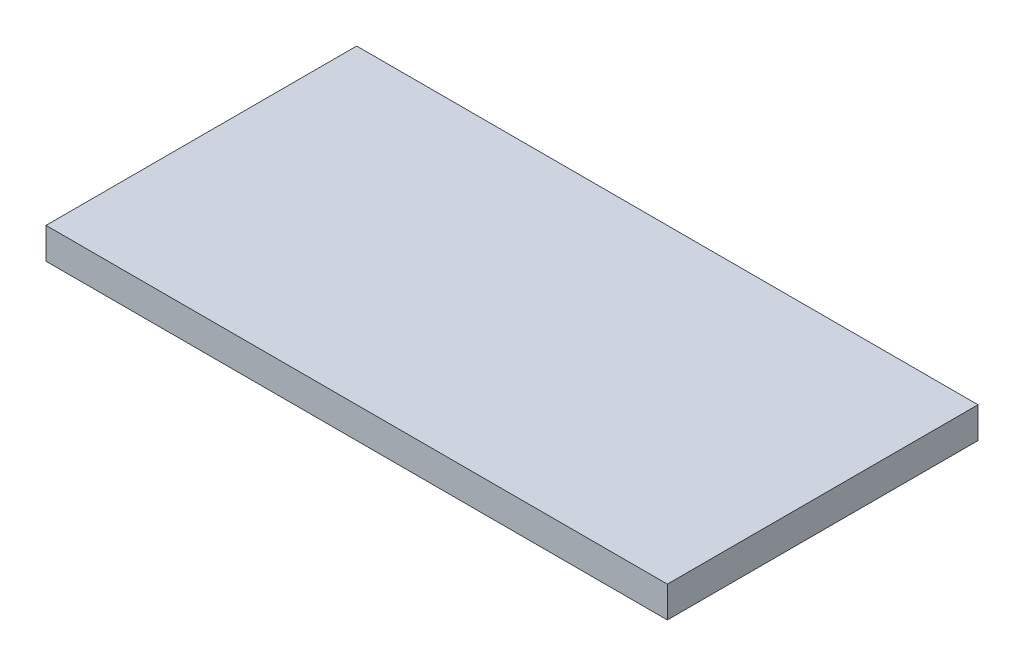
ISO-10303-21;
HEADER;
FILE_DESCRIPTION(('STEP AP214'),'2;1');
FILE_NAME('part.step','',(''),(''),'','','');
FILE_SCHEMA(('AUTOMOTIVE_DESIGN { 1 0 10303 214 1 1 1 1 }'));
ENDSEC;
DATA;
#1=APPLICATION_CONTEXT('core data for automotive mechanical design processes');
#2=APPLICATION_PROTOCOL_DEFINITION('international standard','automotive_design',2000,#1);
#3=PRODUCT_CONTEXT('',#1,'mechanical');
#4=PRODUCT('Part','Part','',(#3));
#5=PRODUCT_RELATED_PRODUCT_CATEGORY('part','',(#4));
#6=PRODUCT_DEFINITION_FORMATION('','',#4);
#7=PRODUCT_DEFINITION_CONTEXT('part definition',#1,'design');
#8=PRODUCT_DEFINITION('design','',#6,#7);
#9=PRODUCT_DEFINITION_SHAPE('','',#8);
#10=(LENGTH_UNIT() NAMED_UNIT(*) SI_UNIT(.MILLI.,.METRE.));
#11=(NAMED_UNIT(*) PLANE_ANGLE_UNIT() SI_UNIT($,.RADIAN.));
#12=(NAMED_UNIT(*) SI_UNIT($,.STERADIAN.) SOLID_ANGLE_UNIT());
#13=UNCERTAINTY_MEASURE_WITH_UNIT(LENGTH_MEASURE(1.E-05),#10,'distance_accuracy_value','');
#14=(GEOMETRIC_REPRESENTATION_CONTEXT(3) GLOBAL_UNCERTAINTY_ASSIGNED_CONTEXT((#13)) GLOBAL_UNIT_ASSIGNED_CONTEXT((#10,
#11,#12)) REPRESENTATION_CONTEXT('',''));
#15=CARTESIAN_POINT('',(0.,0.,0.));
#16=DIRECTION('',(0.,0.,1.));
#17=DIRECTION('',(1.,0.,0.));
#18=AXIS2_PLACEMENT_3D('',#15,#16,#17);
#19=CARTESIAN_POINT('',(200.,862.,-400.));
#20=DIRECTION('',(-1.,0.,0.));
#21=DIRECTION('',(0.,0.,1.));
#22=AXIS2_PLACEMENT_3D('',#19,#20,#21);
#23=PLANE('',#22);
#24=DIRECTION('',(0.,-1.,0.));
#25=VECTOR('',#24,1.);
#26=CARTESIAN_POINT('',(200.,862.,-300.));
#27=LINE('',#26,#25);
#28=CARTESIAN_POINT('',(200.,872.,-300.));
#29=VERTEX_POINT('',#28);
#30=CARTESIAN_POINT('',(200.,862.,-300.));
#31=VERTEX_POINT('',#30);
#32=EDGE_CURVE('E103',#29,#31,#27,.T.);
#33=ORIENTED_EDGE('',*,*,#32,.F.);
#34=DIRECTION('',(0.,0.,1.));
#35=VECTOR('',#34,1.);
#36=CARTESIAN_POINT('',(200.,872.,-400.));
#37=LINE('',#36,#35);
#38=CARTESIAN_POINT('',(200.,872.,-400.));
#39=VERTEX_POINT('',#38);
#40=EDGE_CURVE('E11',#39,#29,#37,.T.);
#41=ORIENTED_EDGE('',*,*,#40,.F.);
#42=DIRECTION('',(0.,-1.,0.));
#43=VECTOR('',#42,1.);
#44=CARTESIAN_POINT('',(200.,862.,-400.));
#45=LINE('',#44,#43);
#46=CARTESIAN_POINT('',(200.,862.,-400.));
#47=VERTEX_POINT('',#46);
#48=EDGE_CURVE('E97',#39,#47,#45,.T.);
#49=ORIENTED_EDGE('',*,*,#48,.T.);
#50=DIRECTION('',(0.,0.,1.));
#51=VECTOR('',#50,1.);
#52=CARTESIAN_POINT('',(200.,862.,-400.));
#53=LINE('',#52,#51);
#54=EDGE_CURVE('E42',#47,#31,#53,.T.);
#55=ORIENTED_EDGE('',*,*,#54,.T.);
#56=EDGE_LOOP('',(#33,#41,#49,#55));
#57=FACE_BOUND('',#56,.T.);
#58=ADVANCED_FACE('F39',(#57),#23,.T.);
#59=CARTESIAN_POINT('',(200.,872.,-400.));
#60=DIRECTION('',(0.,1.,0.));
#61=DIRECTION('',(0.,0.,1.));
#62=AXIS2_PLACEMENT_3D('',#59,#60,#61);
#63=PLANE('',#62);
#64=DIRECTION('',(-1.,0.,0.));
#65=VECTOR('',#64,1.);
#66=CARTESIAN_POINT('',(200.,872.,-300.));
#67=LINE('',#66,#65);
#68=CARTESIAN_POINT('',(400.,872.,-300.));
#69=VERTEX_POINT('',#68);
#70=EDGE_CURVE('E99',#69,#29,#67,.T.);
#71=ORIENTED_EDGE('',*,*,#70,.F.);
#72=DIRECTION('',(0.,0.,1.));
#73=VECTOR('',#72,1.);
#74=CARTESIAN_POINT('',(400.,872.,-400.));
#75=LINE('',#74,#73);
#76=CARTESIAN_POINT('',(400.,872.,-400.));
#77=VERTEX_POINT('',#76);
#78=EDGE_CURVE('E48',#77,#69,#75,.T.);
#79=ORIENTED_EDGE('',*,*,#78,.F.);
#80=DIRECTION('',(-1.,0.,0.));
#81=VECTOR('',#80,1.);
#82=CARTESIAN_POINT('',(200.,872.,-400.));
#83=LINE('',#82,#81);
#84=EDGE_CURVE('E94',#77,#39,#83,.T.);
#85=ORIENTED_EDGE('',*,*,#84,.T.);
#86=ORIENTED_EDGE('',*,*,#40,.T.);
#87=EDGE_LOOP('',(#71,#79,#85,#86));
#88=FACE_BOUND('',#87,.T.);
#89=ADVANCED_FACE('F113',(#88),#63,.T.);
#90=CARTESIAN_POINT('',(400.,862.,-400.));
#91=DIRECTION('',(1.,0.,0.));
#92=DIRECTION('',(0.,0.,-1.));
#93=AXIS2_PLACEMENT_3D('',#90,#91,#92);
#94=PLANE('',#93);
#95=DIRECTION('',(0.,1.,0.));
#96=VECTOR('',#95,1.);
#97=CARTESIAN_POINT('',(400.,862.,-300.));
#98=LINE('',#97,#96);
#99=CARTESIAN_POINT('',(400.,862.,-300.));
#100=VERTEX_POINT('',#99);
#101=EDGE_CURVE('E89',#100,#69,#98,.T.);
#102=ORIENTED_EDGE('',*,*,#101,.F.);
#103=DIRECTION('',(0.,0.,1.));
#104=VECTOR('',#103,1.);
#105=CARTESIAN_POINT('',(400.,862.,-400.));
#106=LINE('',#105,#104);
#107=CARTESIAN_POINT('',(400.,862.,-400.));
#108=VERTEX_POINT('',#107);
#109=EDGE_CURVE('E84',#108,#100,#106,.T.);
#110=ORIENTED_EDGE('',*,*,#109,.F.);
#111=DIRECTION('',(0.,1.,0.));
#112=VECTOR('',#111,1.);
#113=CARTESIAN_POINT('',(400.,862.,-400.));
#114=LINE('',#113,#112);
#115=EDGE_CURVE('E87',#108,#77,#114,.T.);
#116=ORIENTED_EDGE('',*,*,#115,.T.);
#117=ORIENTED_EDGE('',*,*,#78,.T.);
#118=EDGE_LOOP('',(#102,#110,#116,#117));
#119=FACE_BOUND('',#118,.T.);
#120=ADVANCED_FACE('F86',(#119),#94,.T.);
#121=CARTESIAN_POINT('',(200.,862.,-400.));
#122=DIRECTION('',(0.,-1.,0.));
#123=DIRECTION('',(0.,0.,-1.));
#124=AXIS2_PLACEMENT_3D('',#121,#122,#123);
#125=PLANE('',#124);
#126=DIRECTION('',(1.,0.,0.));
#127=VECTOR('',#126,1.);
#128=CARTESIAN_POINT('',(200.,862.,-300.));
#129=LINE('',#128,#127);
#130=EDGE_CURVE('E106',#31,#100,#129,.T.);
#131=ORIENTED_EDGE('',*,*,#130,.F.);
#132=ORIENTED_EDGE('',*,*,#54,.F.);
#133=DIRECTION('',(1.,0.,0.));
#134=VECTOR('',#133,1.);
#135=CARTESIAN_POINT('',(200.,862.,-400.));
#136=LINE('',#135,#134);
#137=EDGE_CURVE('E93',#47,#108,#136,.T.);
#138=ORIENTED_EDGE('',*,*,#137,.T.);
#139=ORIENTED_EDGE('',*,*,#109,.T.);
#140=EDGE_LOOP('',(#131,#132,#138,#139));
#141=FACE_BOUND('',#140,.T.);
#142=ADVANCED_FACE('F96',(#141),#125,.T.);
#143=CARTESIAN_POINT('',(0.,0.,-400.));
#144=DIRECTION('',(0.,0.,-1.));
#145=DIRECTION('',(-1.,0.,0.));
#146=AXIS2_PLACEMENT_3D('',#143,#144,#145);
#147=PLANE('',#146);
#148=ORIENTED_EDGE('',*,*,#48,.F.);
#149=ORIENTED_EDGE('',*,*,#84,.F.);
#150=ORIENTED_EDGE('',*,*,#115,.F.);
#151=ORIENTED_EDGE('',*,*,#137,.F.);
#152=EDGE_LOOP('',(#148,#149,#150,#151));
#153=FACE_BOUND('',#152,.T.);
#154=ADVANCED_FACE('F92',(#153),#147,.T.);
#155=CARTESIAN_POINT('',(0.,0.,-300.));
#156=DIRECTION('',(0.,0.,-1.));
#157=DIRECTION('',(-1.,0.,0.));
#158=AXIS2_PLACEMENT_3D('',#155,#156,#157);
#159=PLANE('',#158);
#160=ORIENTED_EDGE('',*,*,#32,.T.);
#161=ORIENTED_EDGE('',*,*,#130,.T.);
#162=ORIENTED_EDGE('',*,*,#101,.T.);
#163=ORIENTED_EDGE('',*,*,#70,.T.);
#164=EDGE_LOOP('',(#160,#161,#162,#163));
#165=FACE_BOUND('',#164,.T.);
#166=ADVANCED_FACE('F112',(#165),#159,.F.);
#167=CLOSED_SHELL('',(#58,#89,#120,#142,#154,#166));
#168=MANIFOLD_SOLID_BREP('B2',#167);
#169=ADVANCED_BREP_SHAPE_REPRESENTATION('',(#18,#168),#14);
#170=SHAPE_DEFINITION_REPRESENTATION(#9,#169);
ENDSEC;
END-ISO-10303-21;
